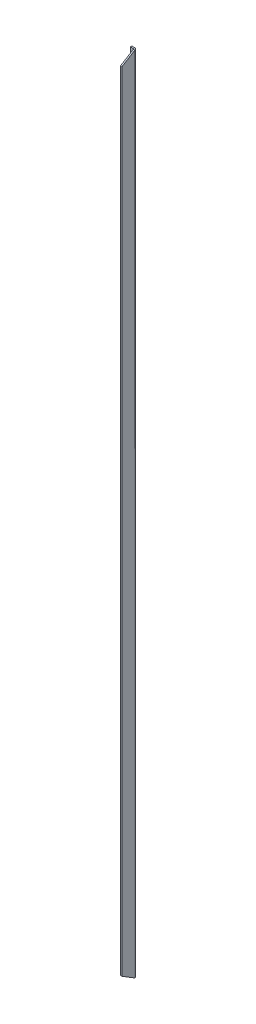
ISO-10303-21;
HEADER;
FILE_DESCRIPTION(('STEP AP214'),'2;1');
FILE_NAME('part.step','',(''),(''),'','','');
FILE_SCHEMA(('AUTOMOTIVE_DESIGN { 1 0 10303 214 1 1 1 1 }'));
ENDSEC;
DATA;
#1=APPLICATION_CONTEXT('core data for automotive mechanical design processes');
#2=APPLICATION_PROTOCOL_DEFINITION('international standard','automotive_design',2000,#1);
#3=PRODUCT_CONTEXT('',#1,'mechanical');
#4=PRODUCT('Part','Part','',(#3));
#5=PRODUCT_RELATED_PRODUCT_CATEGORY('part','',(#4));
#6=PRODUCT_DEFINITION_FORMATION('','',#4);
#7=PRODUCT_DEFINITION_CONTEXT('part definition',#1,'design');
#8=PRODUCT_DEFINITION('design','',#6,#7);
#9=PRODUCT_DEFINITION_SHAPE('','',#8);
#10=(LENGTH_UNIT() NAMED_UNIT(*) SI_UNIT(.MILLI.,.METRE.));
#11=(NAMED_UNIT(*) PLANE_ANGLE_UNIT() SI_UNIT($,.RADIAN.));
#12=(NAMED_UNIT(*) SI_UNIT($,.STERADIAN.) SOLID_ANGLE_UNIT());
#13=UNCERTAINTY_MEASURE_WITH_UNIT(LENGTH_MEASURE(1.E-05),#10,'distance_accuracy_value','');
#14=(GEOMETRIC_REPRESENTATION_CONTEXT(3) GLOBAL_UNCERTAINTY_ASSIGNED_CONTEXT((#13)) GLOBAL_UNIT_ASSIGNED_CONTEXT((#10,
#11,#12)) REPRESENTATION_CONTEXT('',''));
#15=CARTESIAN_POINT('',(0.,0.,0.));
#16=DIRECTION('',(0.,0.,1.));
#17=DIRECTION('',(1.,0.,0.));
#18=AXIS2_PLACEMENT_3D('',#15,#16,#17);
#19=CARTESIAN_POINT('',(1160.,-730.,3525.19389719171));
#20=DIRECTION('',(-1.,0.,0.));
#21=DIRECTION('',(0.,0.,1.));
#22=AXIS2_PLACEMENT_3D('',#19,#20,#21);
#23=PLANE('',#22);
#24=DIRECTION('',(0.,0.,-1.));
#25=VECTOR('',#24,1.);
#26=CARTESIAN_POINT('',(1160.,886.292893218814,3525.19389719171));
#27=LINE('',#26,#25);
#28=CARTESIAN_POINT('',(1160.,886.292893218814,302.999999999999));
#29=VERTEX_POINT('',#28);
#30=CARTESIAN_POINT('',(1160.,886.292893218814,299.999999999999));
#31=VERTEX_POINT('',#30);
#32=EDGE_CURVE('E196',#29,#31,#27,.T.);
#33=ORIENTED_EDGE('',*,*,#32,.T.);
#34=DIRECTION('',(0.,1.,0.));
#35=VECTOR('',#34,1.);
#36=CARTESIAN_POINT('',(1160.,80.0000000000003,299.999999999999));
#37=LINE('',#36,#35);
#38=CARTESIAN_POINT('',(1160.,-726.292893218813,299.999999999999));
#39=VERTEX_POINT('',#38);
#40=EDGE_CURVE('E168',#39,#31,#37,.T.);
#41=ORIENTED_EDGE('',*,*,#40,.F.);
#42=DIRECTION('',(0.,0.,-1.));
#43=VECTOR('',#42,1.);
#44=CARTESIAN_POINT('',(1160.,-726.292893218813,3525.19389719171));
#45=LINE('',#44,#43);
#46=CARTESIAN_POINT('',(1160.,-726.292893218813,302.999999999999));
#47=VERTEX_POINT('',#46);
#48=EDGE_CURVE('E170',#47,#39,#45,.T.);
#49=ORIENTED_EDGE('',*,*,#48,.F.);
#50=DIRECTION('',(0.,1.,0.));
#51=VECTOR('',#50,1.);
#52=CARTESIAN_POINT('',(1160.,-730.,302.999999999999));
#53=LINE('',#52,#51);
#54=EDGE_CURVE('E183',#47,#29,#53,.T.);
#55=ORIENTED_EDGE('',*,*,#54,.T.);
#56=EDGE_LOOP('',(#33,#41,#49,#55));
#57=FACE_BOUND('',#56,.T.);
#58=ADVANCED_FACE('F59',(#57),#23,.T.);
#59=CARTESIAN_POINT('',(1167.,886.292893218815,3525.19389719171));
#60=DIRECTION('',(0.,1.,0.));
#61=DIRECTION('',(1.,0.,0.));
#62=AXIS2_PLACEMENT_3D('',#59,#60,#61);
#63=PLANE('',#62);
#64=CARTESIAN_POINT('',(1166.,886.292893218814,299.999999999999));
#65=CARTESIAN_POINT('',(1166.,886.292893218814,302.999999999999));
#66=B_SPLINE_CURVE_WITH_KNOTS('',1,(#64,#65),.UNSPECIFIED.,.F.,.F.,(2,2),(0.,1.),.UNSPECIFIED.);
#67=CARTESIAN_POINT('',(1166.,886.292893218812,302.999999999999));
#68=VERTEX_POINT('',#67);
#69=CARTESIAN_POINT('',(1166.,886.292893218814,299.999999999999));
#70=VERTEX_POINT('',#69);
#71=EDGE_CURVE('E174',#68,#70,#66,.F.);
#72=ORIENTED_EDGE('',*,*,#71,.T.);
#73=DIRECTION('',(-1.,0.,0.));
#74=VECTOR('',#73,1.);
#75=CARTESIAN_POINT('',(1167.,886.292893218814,299.999999999999));
#76=LINE('',#75,#74);
#77=EDGE_CURVE('E120',#31,#70,#76,.F.);
#78=ORIENTED_EDGE('',*,*,#77,.F.);
#79=ORIENTED_EDGE('',*,*,#32,.F.);
#80=DIRECTION('',(1.,0.,0.));
#81=VECTOR('',#80,1.);
#82=CARTESIAN_POINT('',(1167.,886.292893218814,302.999999999999));
#83=LINE('',#82,#81);
#84=EDGE_CURVE('E176',#29,#68,#83,.T.);
#85=ORIENTED_EDGE('',*,*,#84,.T.);
#86=EDGE_LOOP('',(#72,#78,#79,#85));
#87=FACE_BOUND('',#86,.T.);
#88=ADVANCED_FACE('F175',(#87),#63,.T.);
#89=CARTESIAN_POINT('',(1167.,80.0000000000003,299.999999999999));
#90=DIRECTION('',(0.,0.,-1.));
#91=DIRECTION('',(-1.,0.,0.));
#92=AXIS2_PLACEMENT_3D('',#89,#90,#91);
#93=PLANE('',#92);
#94=DIRECTION('',(-1.,0.,0.));
#95=VECTOR('',#94,1.);
#96=CARTESIAN_POINT('',(1167.,-726.292893218813,299.999999999999));
#97=LINE('',#96,#95);
#98=CARTESIAN_POINT('',(1166.,-726.292893218813,299.999999999998));
#99=VERTEX_POINT('',#98);
#100=EDGE_CURVE('E425',#99,#39,#97,.T.);
#101=ORIENTED_EDGE('',*,*,#100,.T.);
#102=ORIENTED_EDGE('',*,*,#40,.T.);
#103=ORIENTED_EDGE('',*,*,#77,.T.);
#104=DIRECTION('',(0.,-1.,0.));
#105=VECTOR('',#104,1.);
#106=CARTESIAN_POINT('',(1166.,-726.292893218814,299.999999999999));
#107=LINE('',#106,#105);
#108=EDGE_CURVE('E110',#99,#70,#107,.F.);
#109=ORIENTED_EDGE('',*,*,#108,.F.);
#110=EDGE_LOOP('',(#101,#102,#103,#109));
#111=FACE_BOUND('',#110,.T.);
#112=ADVANCED_FACE('F166',(#111),#93,.T.);
#113=CARTESIAN_POINT('',(1167.,-726.292893218813,3525.19389719171));
#114=DIRECTION('',(0.,1.,0.));
#115=DIRECTION('',(1.,0.,0.));
#116=AXIS2_PLACEMENT_3D('',#113,#114,#115);
#117=PLANE('',#116);
#118=ORIENTED_EDGE('',*,*,#100,.F.);
#119=CARTESIAN_POINT('',(1166.,-726.292893218813,302.999999999999));
#120=CARTESIAN_POINT('',(1166.,-726.292893218813,299.999999999999));
#121=B_SPLINE_CURVE_WITH_KNOTS('',1,(#119,#120),.UNSPECIFIED.,.F.,.F.,(2,2),(0.,1.),.UNSPECIFIED.);
#122=CARTESIAN_POINT('',(1166.,-726.292893218805,302.999999999999));
#123=VERTEX_POINT('',#122);
#124=EDGE_CURVE('E197',#123,#99,#121,.T.);
#125=ORIENTED_EDGE('',*,*,#124,.F.);
#126=DIRECTION('',(1.,0.,0.));
#127=VECTOR('',#126,1.);
#128=CARTESIAN_POINT('',(1167.,-726.292893218813,302.999999999999));
#129=LINE('',#128,#127);
#130=EDGE_CURVE('E14',#47,#123,#129,.T.);
#131=ORIENTED_EDGE('',*,*,#130,.F.);
#132=ORIENTED_EDGE('',*,*,#48,.T.);
#133=EDGE_LOOP('',(#118,#125,#131,#132));
#134=FACE_BOUND('',#133,.T.);
#135=ADVANCED_FACE('F339',(#134),#117,.F.);
#136=CARTESIAN_POINT('',(1167.,80.0000000000003,302.999999999999));
#137=DIRECTION('',(0.,0.,-1.));
#138=DIRECTION('',(-1.,0.,0.));
#139=AXIS2_PLACEMENT_3D('',#136,#137,#138);
#140=PLANE('',#139);
#141=DIRECTION('',(0.,-1.,0.));
#142=VECTOR('',#141,1.);
#143=CARTESIAN_POINT('',(1166.,-726.292893218814,302.999999999999));
#144=LINE('',#143,#142);
#145=EDGE_CURVE('E73',#123,#68,#144,.F.);
#146=ORIENTED_EDGE('',*,*,#145,.T.);
#147=ORIENTED_EDGE('',*,*,#84,.F.);
#148=ORIENTED_EDGE('',*,*,#54,.F.);
#149=ORIENTED_EDGE('',*,*,#130,.T.);
#150=EDGE_LOOP('',(#146,#147,#148,#149));
#151=FACE_BOUND('',#150,.T.);
#152=ADVANCED_FACE('F62',(#151),#140,.F.);
#153=CARTESIAN_POINT('',(-2054.41932756892,-381.416309013,863.948497854055));
#154=DIRECTION('',(0.,0.851658316704624,-0.524097425664204));
#155=DIRECTION('',(0.,0.524097425664204,0.851658316704624));
#156=AXIS2_PLACEMENT_3D('',#153,#154,#155);
#157=PLANE('',#156);
#158=DIRECTION('',(0.,0.524097425664204,0.851658316704624));
#159=VECTOR('',#158,1.);
#160=CARTESIAN_POINT('',(1170.,-381.416309013,863.948497854056));
#161=LINE('',#160,#159);
#162=CARTESIAN_POINT('',(1170.,-725.999999999997,303.999999999999));
#163=VERTEX_POINT('',#162);
#164=CARTESIAN_POINT('',(1170.,-710.000000000001,329.999999999999));
#165=VERTEX_POINT('',#164);
#166=EDGE_CURVE('E138',#163,#165,#161,.T.);
#167=ORIENTED_EDGE('',*,*,#166,.T.);
#168=DIRECTION('',(1.,0.,0.));
#169=VECTOR('',#168,1.);
#170=CARTESIAN_POINT('',(-2054.41932756892,-710.000000000001,329.999999999998));
#171=LINE('',#170,#169);
#172=CARTESIAN_POINT('',(1167.,-710.000000000001,329.999999999999));
#173=VERTEX_POINT('',#172);
#174=EDGE_CURVE('E486',#173,#165,#171,.T.);
#175=ORIENTED_EDGE('',*,*,#174,.F.);
#176=DIRECTION('',(0.,0.524097425664204,0.851658316704624));
#177=VECTOR('',#176,1.);
#178=CARTESIAN_POINT('',(1167.,-381.416309013,863.948497854056));
#179=LINE('',#178,#177);
#180=CARTESIAN_POINT('',(1167.,-725.999999999997,303.999999999999));
#181=VERTEX_POINT('',#180);
#182=EDGE_CURVE('E303',#181,#173,#179,.T.);
#183=ORIENTED_EDGE('',*,*,#182,.F.);
#184=CARTESIAN_POINT('',(1170.,-726.000000000003,303.999999999999));
#185=CARTESIAN_POINT('',(1167.,-726.000000000003,303.999999999999));
#186=B_SPLINE_CURVE_WITH_KNOTS('',1,(#184,#185),.UNSPECIFIED.,.F.,.F.,(2,2),(0.,1.),.UNSPECIFIED.);
#187=EDGE_CURVE('E132',#181,#163,#186,.F.);
#188=ORIENTED_EDGE('',*,*,#187,.T.);
#189=EDGE_LOOP('',(#167,#175,#183,#188));
#190=FACE_BOUND('',#189,.T.);
#191=ADVANCED_FACE('F320',(#190),#157,.F.);
#192=CARTESIAN_POINT('',(-2054.41932756892,-710.000000000001,329.999999999998));
#193=DIRECTION('',(0.,0.,-1.));
#194=DIRECTION('',(-1.,0.,0.));
#195=AXIS2_PLACEMENT_3D('',#192,#193,#194);
#196=PLANE('',#195);
#197=DIRECTION('',(0.,1.,0.));
#198=VECTOR('',#197,1.);
#199=CARTESIAN_POINT('',(1170.,80.0000000000003,329.999999999999));
#200=LINE('',#199,#198);
#201=CARTESIAN_POINT('',(1170.,870.000000000001,329.999999999999));
#202=VERTEX_POINT('',#201);
#203=EDGE_CURVE('E287',#202,#165,#200,.F.);
#204=ORIENTED_EDGE('',*,*,#203,.F.);
#205=DIRECTION('',(1.,0.,0.));
#206=VECTOR('',#205,1.);
#207=CARTESIAN_POINT('',(-2054.41932756892,870.000000000001,329.999999999998));
#208=LINE('',#207,#206);
#209=CARTESIAN_POINT('',(1167.,870.000000000001,329.999999999999));
#210=VERTEX_POINT('',#209);
#211=EDGE_CURVE('E304',#210,#202,#208,.T.);
#212=ORIENTED_EDGE('',*,*,#211,.F.);
#213=DIRECTION('',(0.,1.,0.));
#214=VECTOR('',#213,1.);
#215=CARTESIAN_POINT('',(1167.,-710.000000000001,329.999999999999));
#216=LINE('',#215,#214);
#217=EDGE_CURVE('E298',#173,#210,#216,.T.);
#218=ORIENTED_EDGE('',*,*,#217,.F.);
#219=ORIENTED_EDGE('',*,*,#174,.T.);
#220=EDGE_LOOP('',(#204,#212,#218,#219));
#221=FACE_BOUND('',#220,.T.);
#222=ADVANCED_FACE('F330',(#221),#196,.F.);
#223=CARTESIAN_POINT('',(-2054.41932756892,541.416309012868,863.948497854077));
#224=DIRECTION('',(0.,-0.851658316704539,-0.524097425664342));
#225=DIRECTION('',(0.,0.524097425664342,-0.851658316704539));
#226=AXIS2_PLACEMENT_3D('',#223,#224,#225);
#227=PLANE('',#226);
#228=DIRECTION('',(0.,0.524097425664342,-0.851658316704539));
#229=VECTOR('',#228,1.);
#230=CARTESIAN_POINT('',(1170.,541.416309012868,863.948497854077));
#231=LINE('',#230,#229);
#232=CARTESIAN_POINT('',(1170.,886.000000000001,303.999999999999));
#233=VERTEX_POINT('',#232);
#234=EDGE_CURVE('E297',#202,#233,#231,.T.);
#235=ORIENTED_EDGE('',*,*,#234,.T.);
#236=CARTESIAN_POINT('',(1167.,886.,303.999999999999));
#237=CARTESIAN_POINT('',(1170.,886.,303.999999999999));
#238=B_SPLINE_CURVE_WITH_KNOTS('',1,(#236,#237),.UNSPECIFIED.,.F.,.F.,(2,2),(0.,1.),.UNSPECIFIED.);
#239=CARTESIAN_POINT('',(1167.,886.,303.999999999999));
#240=VERTEX_POINT('',#239);
#241=EDGE_CURVE('E203',#240,#233,#238,.T.);
#242=ORIENTED_EDGE('',*,*,#241,.F.);
#243=DIRECTION('',(0.,0.524097425664342,-0.851658316704539));
#244=VECTOR('',#243,1.);
#245=CARTESIAN_POINT('',(1167.,541.416309012868,863.948497854077));
#246=LINE('',#245,#244);
#247=EDGE_CURVE('E302',#210,#240,#246,.T.);
#248=ORIENTED_EDGE('',*,*,#247,.F.);
#249=ORIENTED_EDGE('',*,*,#211,.T.);
#250=EDGE_LOOP('',(#235,#242,#248,#249));
#251=FACE_BOUND('',#250,.T.);
#252=ADVANCED_FACE('F444',(#251),#227,.F.);
#253=CARTESIAN_POINT('',(1167.,80.0000000000003,579.999999999999));
#254=DIRECTION('',(1.,0.,0.));
#255=DIRECTION('',(0.,0.,-1.));
#256=AXIS2_PLACEMENT_3D('',#253,#254,#255);
#257=PLANE('',#256);
#258=DIRECTION('',(0.,1.,0.));
#259=VECTOR('',#258,1.);
#260=CARTESIAN_POINT('',(1167.,80.0000000000003,303.999999999999));
#261=LINE('',#260,#259);
#262=EDGE_CURVE('E296',#181,#240,#261,.T.);
#263=ORIENTED_EDGE('',*,*,#262,.F.);
#264=ORIENTED_EDGE('',*,*,#182,.T.);
#265=ORIENTED_EDGE('',*,*,#217,.T.);
#266=ORIENTED_EDGE('',*,*,#247,.T.);
#267=EDGE_LOOP('',(#263,#264,#265,#266));
#268=FACE_BOUND('',#267,.T.);
#269=ADVANCED_FACE('F453',(#268),#257,.F.);
#270=CARTESIAN_POINT('',(1170.,80.0000000000003,579.999999999999));
#271=DIRECTION('',(1.,0.,0.));
#272=DIRECTION('',(0.,0.,-1.));
#273=AXIS2_PLACEMENT_3D('',#270,#271,#272);
#274=PLANE('',#273);
#275=ORIENTED_EDGE('',*,*,#166,.F.);
#276=DIRECTION('',(0.,1.,0.));
#277=VECTOR('',#276,1.);
#278=CARTESIAN_POINT('',(1170.,80.0000000000003,303.999999999999));
#279=LINE('',#278,#277);
#280=EDGE_CURVE('E364',#163,#233,#279,.T.);
#281=ORIENTED_EDGE('',*,*,#280,.T.);
#282=ORIENTED_EDGE('',*,*,#234,.F.);
#283=ORIENTED_EDGE('',*,*,#203,.T.);
#284=EDGE_LOOP('',(#275,#281,#282,#283));
#285=FACE_BOUND('',#284,.T.);
#286=ADVANCED_FACE('F232',(#285),#274,.T.);
#287=CARTESIAN_POINT('',(1166.,886.292893218814,299.999999999999));
#288=CARTESIAN_POINT('',(1166.52369297434,886.268481059467,299.999999999999));
#289=CARTESIAN_POINT('',(1167.04699153744,886.244077682345,300.104109293326));
#290=CARTESIAN_POINT('',(1168.01447592148,886.195262145876,300.504854446582));
#291=CARTESIAN_POINT('',(1168.4581868799,886.170854377641,300.801332630406));
#292=CARTESIAN_POINT('',(1169.19866736959,886.122038841173,301.541813120099));
#293=CARTESIAN_POINT('',(1169.49514555342,886.097631072938,301.985524078515));
#294=CARTESIAN_POINT('',(1169.89589070667,886.048815536469,302.953008462562));
#295=CARTESIAN_POINT('',(1170.,886.024412159347,303.476307025661));
#296=CARTESIAN_POINT('',(1170.,886.,303.999999999999));
#297=CARTESIAN_POINT('',(1166.,886.292893218814,302.999999999999));
#298=CARTESIAN_POINT('',(1166.13092250177,886.268481197786,302.999999999999));
#299=CARTESIAN_POINT('',(1166.26174788436,886.244077682345,303.026027323331));
#300=CARTESIAN_POINT('',(1166.50361898037,886.195262145876,303.126213611645));
#301=CARTESIAN_POINT('',(1166.61454671997,886.170854377641,303.200333157601));
#302=CARTESIAN_POINT('',(1166.7996668424,886.122038841173,303.385453280024));
#303=CARTESIAN_POINT('',(1166.87378638835,886.097631072938,303.496381019628));
#304=CARTESIAN_POINT('',(1166.97397267667,886.048815536469,303.73825211564));
#305=CARTESIAN_POINT('',(1167.,886.024412021028,303.869077498224));
#306=CARTESIAN_POINT('',(1167.,886.,303.999999999999));
#307=B_SPLINE_SURFACE_WITH_KNOTS('',1,3,((#287,#288,#289,#290,#291,#292,#293,#294,#295,#296),
(#297,#298,#299,#300,#301,#302,#303,#304,#305,#306)),.UNSPECIFIED.,.F.,.F.,.F.,(2,2),(4,2,2,2,
4),(0.,1.),(0.,0.25,0.5,0.75,1.),.UNSPECIFIED.);
#308=CARTESIAN_POINT('',(1166.,886.292893218814,302.999999999999));
#309=CARTESIAN_POINT('',(1166.13092250177,886.268481197786,302.999999999999));
#310=CARTESIAN_POINT('',(1166.26174788436,886.244077682345,303.026027323331));
#311=CARTESIAN_POINT('',(1166.50361898037,886.195262145876,303.126213611645));
#312=CARTESIAN_POINT('',(1166.61454671997,886.170854377641,303.200333157601));
#313=CARTESIAN_POINT('',(1166.7996668424,886.122038841173,303.385453280024));
#314=CARTESIAN_POINT('',(1166.87378638835,886.097631072938,303.496381019628));
#315=CARTESIAN_POINT('',(1166.97397267667,886.048815536469,303.73825211564));
#316=CARTESIAN_POINT('',(1167.,886.024412021028,303.869077498224));
#317=CARTESIAN_POINT('',(1167.,886.,303.999999999999));
#318=B_SPLINE_CURVE_WITH_KNOTS('',3,(#308,#309,#310,#311,#312,#313,#314,#315,#316,#317),
.UNSPECIFIED.,.F.,.F.,(4,2,2,2,4),(0.,0.25,0.5,0.75,1.),.UNSPECIFIED.);
#319=EDGE_CURVE('E401',#68,#240,#318,.T.);
#320=CARTESIAN_POINT('',(1170.,886.,303.999999999999));
#321=CARTESIAN_POINT('',(1170.,886.024412159347,303.476307025661));
#322=CARTESIAN_POINT('',(1169.89589070667,886.048815536469,302.953008462562));
#323=CARTESIAN_POINT('',(1169.49514555342,886.097631072938,301.985524078515));
#324=CARTESIAN_POINT('',(1169.19866736959,886.122038841173,301.541813120099));
#325=CARTESIAN_POINT('',(1168.4581868799,886.170854377641,300.801332630406));
#326=CARTESIAN_POINT('',(1168.01447592148,886.195262145876,300.504854446582));
#327=CARTESIAN_POINT('',(1167.04699153744,886.244077682345,300.104109293326));
#328=CARTESIAN_POINT('',(1166.52369297434,886.268481059467,299.999999999999));
#329=CARTESIAN_POINT('',(1166.,886.292893218814,299.999999999999));
#330=B_SPLINE_CURVE_WITH_KNOTS('',3,(#320,#321,#322,#323,#324,#325,#326,#327,#328,#329),
.UNSPECIFIED.,.F.,.F.,(4,2,2,2,4),(0.,0.25,0.5,0.75,1.),.UNSPECIFIED.);
#331=EDGE_CURVE('E190',#70,#233,#330,.F.);
#332=ORIENTED_EDGE('',*,*,#71,.F.);
#333=ORIENTED_EDGE('',*,*,#319,.T.);
#334=ORIENTED_EDGE('',*,*,#241,.T.);
#335=ORIENTED_EDGE('',*,*,#331,.F.);
#336=EDGE_LOOP('',(#332,#333,#334,#335));
#337=FACE_BOUND('',#336,.T.);
#338=ADVANCED_FACE('F201',(#337),#307,.T.);
#339=CARTESIAN_POINT('',(1170.,-726.000000000003,303.999999999999));
#340=CARTESIAN_POINT('',(1170.,-726.024412159349,303.476307025661));
#341=CARTESIAN_POINT('',(1169.89589070667,-726.048815536471,302.953008462562));
#342=CARTESIAN_POINT('',(1169.49514555342,-726.097631072939,301.985524078516));
#343=CARTESIAN_POINT('',(1169.19866736959,-726.122038841173,301.5418131201));
#344=CARTESIAN_POINT('',(1168.4581868799,-726.170854377642,300.801332630407));
#345=CARTESIAN_POINT('',(1168.01447592148,-726.195262145876,300.504854446582));
#346=CARTESIAN_POINT('',(1167.04699153744,-726.244077682345,300.104109293326));
#347=CARTESIAN_POINT('',(1166.52369297434,-726.268481059466,299.999999999999));
#348=CARTESIAN_POINT('',(1166.,-726.292893218813,299.999999999999));
#349=CARTESIAN_POINT('',(1167.,-726.000000000003,303.999999999999));
#350=CARTESIAN_POINT('',(1167.,-726.02441202103,303.869077498224));
#351=CARTESIAN_POINT('',(1166.97397267667,-726.048815536471,303.73825211564));
#352=CARTESIAN_POINT('',(1166.87378638835,-726.097631072939,303.496381019628));
#353=CARTESIAN_POINT('',(1166.7996668424,-726.122038841173,303.385453280024));
#354=CARTESIAN_POINT('',(1166.61454671997,-726.170854377642,303.200333157601));
#355=CARTESIAN_POINT('',(1166.50361898037,-726.195262145876,303.126213611645));
#356=CARTESIAN_POINT('',(1166.26174788436,-726.244077682345,303.026027323331));
#357=CARTESIAN_POINT('',(1166.13092250178,-726.268481197785,302.999999999999));
#358=CARTESIAN_POINT('',(1166.,-726.292893218813,302.999999999999));
#359=B_SPLINE_SURFACE_WITH_KNOTS('',1,3,((#339,#340,#341,#342,#343,#344,#345,#346,#347,#348),
(#349,#350,#351,#352,#353,#354,#355,#356,#357,#358)),.UNSPECIFIED.,.F.,.F.,.F.,(2,2),(4,2,2,2,
4),(0.,1.),(0.,0.25,0.5,0.75,1.),.UNSPECIFIED.);
#360=CARTESIAN_POINT('',(1167.,-726.000000000003,303.999999999999));
#361=CARTESIAN_POINT('',(1167.,-726.02441202103,303.869077498224));
#362=CARTESIAN_POINT('',(1166.97397267667,-726.048815536471,303.73825211564));
#363=CARTESIAN_POINT('',(1166.87378638835,-726.097631072939,303.496381019628));
#364=CARTESIAN_POINT('',(1166.7996668424,-726.122038841173,303.385453280024));
#365=CARTESIAN_POINT('',(1166.61454671997,-726.170854377642,303.200333157601));
#366=CARTESIAN_POINT('',(1166.50361898037,-726.195262145876,303.126213611645));
#367=CARTESIAN_POINT('',(1166.26174788436,-726.244077682345,303.026027323331));
#368=CARTESIAN_POINT('',(1166.13092250178,-726.268481197785,302.999999999999));
#369=CARTESIAN_POINT('',(1166.,-726.292893218813,302.999999999999));
#370=B_SPLINE_CURVE_WITH_KNOTS('',3,(#360,#361,#362,#363,#364,#365,#366,#367,#368,#369),
.UNSPECIFIED.,.F.,.F.,(4,2,2,2,4),(0.,0.25,0.5,0.75,1.),.UNSPECIFIED.);
#371=EDGE_CURVE('E206',#181,#123,#370,.T.);
#372=CARTESIAN_POINT('',(1166.,-726.292893218813,299.999999999999));
#373=CARTESIAN_POINT('',(1166.52369297434,-726.268481059466,299.999999999999));
#374=CARTESIAN_POINT('',(1167.04699153744,-726.244077682345,300.104109293326));
#375=CARTESIAN_POINT('',(1168.01447592148,-726.195262145876,300.504854446582));
#376=CARTESIAN_POINT('',(1168.4581868799,-726.170854377642,300.801332630407));
#377=CARTESIAN_POINT('',(1169.19866736959,-726.122038841173,301.5418131201));
#378=CARTESIAN_POINT('',(1169.49514555342,-726.097631072939,301.985524078516));
#379=CARTESIAN_POINT('',(1169.89589070667,-726.048815536471,302.953008462562));
#380=CARTESIAN_POINT('',(1170.,-726.024412159349,303.476307025661));
#381=CARTESIAN_POINT('',(1170.,-726.000000000003,303.999999999999));
#382=B_SPLINE_CURVE_WITH_KNOTS('',3,(#372,#373,#374,#375,#376,#377,#378,#379,#380,#381),
.UNSPECIFIED.,.F.,.F.,(4,2,2,2,4),(0.,0.25,0.5,0.75,1.),.UNSPECIFIED.);
#383=EDGE_CURVE('E193',#163,#99,#382,.F.);
#384=ORIENTED_EDGE('',*,*,#371,.T.);
#385=ORIENTED_EDGE('',*,*,#124,.T.);
#386=ORIENTED_EDGE('',*,*,#383,.F.);
#387=ORIENTED_EDGE('',*,*,#187,.F.);
#388=EDGE_LOOP('',(#384,#385,#386,#387));
#389=FACE_BOUND('',#388,.T.);
#390=ADVANCED_FACE('F231',(#389),#359,.T.);
#391=CARTESIAN_POINT('',(1166.,2499.11480297003,303.999999999999));
#392=DIRECTION('',(0.,-1.,0.));
#393=DIRECTION('',(0.,0.,-1.));
#394=AXIS2_PLACEMENT_3D('',#391,#392,#393);
#395=CYLINDRICAL_SURFACE('',#394,3.99999999999978);
#396=ORIENTED_EDGE('',*,*,#280,.F.);
#397=ORIENTED_EDGE('',*,*,#383,.T.);
#398=ORIENTED_EDGE('',*,*,#108,.T.);
#399=ORIENTED_EDGE('',*,*,#331,.T.);
#400=EDGE_LOOP('',(#396,#397,#398,#399));
#401=FACE_BOUND('',#400,.T.);
#402=ADVANCED_FACE('F189',(#401),#395,.T.);
#403=CARTESIAN_POINT('',(1166.,2499.11480297003,303.999999999999));
#404=DIRECTION('',(0.,-1.,0.));
#405=DIRECTION('',(0.,0.,-1.));
#406=AXIS2_PLACEMENT_3D('',#403,#404,#405);
#407=CYLINDRICAL_SURFACE('',#406,0.999999999999888);
#408=ORIENTED_EDGE('',*,*,#262,.T.);
#409=ORIENTED_EDGE('',*,*,#319,.F.);
#410=ORIENTED_EDGE('',*,*,#145,.F.);
#411=ORIENTED_EDGE('',*,*,#371,.F.);
#412=EDGE_LOOP('',(#408,#409,#410,#411));
#413=FACE_BOUND('',#412,.T.);
#414=ADVANCED_FACE('F234',(#413),#407,.F.);
#415=CLOSED_SHELL('',(#58,#88,#112,#135,#152,#191,#222,#252,#269,#286,#338,#390,#402,#414));
#416=MANIFOLD_SOLID_BREP('B2',#415);
#417=ADVANCED_BREP_SHAPE_REPRESENTATION('',(#18,#416),#14);
#418=SHAPE_DEFINITION_REPRESENTATION(#9,#417);
ENDSEC;
END-ISO-10303-21;
